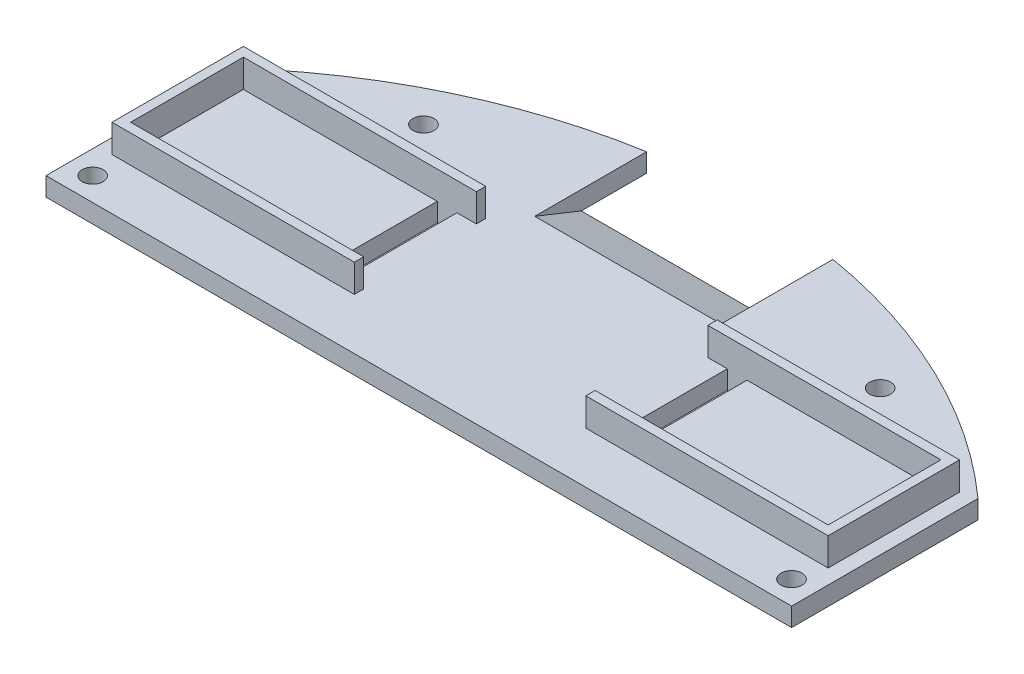
ISO-10303-21;
HEADER;
FILE_DESCRIPTION(('STEP AP214'),'2;1');
FILE_NAME('part.step','',(''),(''),'','','');
FILE_SCHEMA(('AUTOMOTIVE_DESIGN { 1 0 10303 214 1 1 1 1 }'));
ENDSEC;
DATA;
#1=APPLICATION_CONTEXT('core data for automotive mechanical design processes');
#2=APPLICATION_PROTOCOL_DEFINITION('international standard','automotive_design',2000,#1);
#3=PRODUCT_CONTEXT('',#1,'mechanical');
#4=PRODUCT('Part','Part','',(#3));
#5=PRODUCT_RELATED_PRODUCT_CATEGORY('part','',(#4));
#6=PRODUCT_DEFINITION_FORMATION('','',#4);
#7=PRODUCT_DEFINITION_CONTEXT('part definition',#1,'design');
#8=PRODUCT_DEFINITION('design','',#6,#7);
#9=PRODUCT_DEFINITION_SHAPE('','',#8);
#10=(LENGTH_UNIT() NAMED_UNIT(*) SI_UNIT(.MILLI.,.METRE.));
#11=(NAMED_UNIT(*) PLANE_ANGLE_UNIT() SI_UNIT($,.RADIAN.));
#12=(NAMED_UNIT(*) SI_UNIT($,.STERADIAN.) SOLID_ANGLE_UNIT());
#13=UNCERTAINTY_MEASURE_WITH_UNIT(LENGTH_MEASURE(1.E-05),#10,'distance_accuracy_value','');
#14=(GEOMETRIC_REPRESENTATION_CONTEXT(3) GLOBAL_UNCERTAINTY_ASSIGNED_CONTEXT((#13)) GLOBAL_UNIT_ASSIGNED_CONTEXT((#10,
#11,#12)) REPRESENTATION_CONTEXT('',''));
#15=CARTESIAN_POINT('',(0.,0.,0.));
#16=DIRECTION('',(0.,0.,1.));
#17=DIRECTION('',(1.,0.,0.));
#18=AXIS2_PLACEMENT_3D('',#15,#16,#17);
#19=CARTESIAN_POINT('',(0.,2.,34.7213595499958));
#20=DIRECTION('',(0.,-1.,0.));
#21=DIRECTION('',(0.,0.,-1.));
#22=AXIS2_PLACEMENT_3D('',#19,#20,#21);
#23=PLANE('',#22);
#24=DIRECTION('',(-1.,0.,0.));
#25=VECTOR('',#24,1.);
#26=CARTESIAN_POINT('',(-12.4199999977621,2.,3.5));
#27=LINE('',#26,#25);
#28=CARTESIAN_POINT('',(-16.62,2.,3.5));
#29=VERTEX_POINT('',#28);
#30=CARTESIAN_POINT('',(-37.42,2.,3.5));
#31=VERTEX_POINT('',#30);
#32=EDGE_CURVE('E283',#29,#31,#27,.T.);
#33=ORIENTED_EDGE('',*,*,#32,.F.);
#34=DIRECTION('',(0.,0.,1.));
#35=VECTOR('',#34,1.);
#36=CARTESIAN_POINT('',(-16.62,2.,-8.59999999999999));
#37=LINE('',#36,#35);
#38=CARTESIAN_POINT('',(-16.62,2.,-8.6));
#39=VERTEX_POINT('',#38);
#40=EDGE_CURVE('E371',#39,#29,#37,.T.);
#41=ORIENTED_EDGE('',*,*,#40,.F.);
#42=DIRECTION('',(1.,0.,0.));
#43=VECTOR('',#42,1.);
#44=CARTESIAN_POINT('',(-37.42,2.,-8.6));
#45=LINE('',#44,#43);
#46=CARTESIAN_POINT('',(-37.42,2.,-8.6));
#47=VERTEX_POINT('',#46);
#48=EDGE_CURVE('E927',#47,#39,#45,.T.);
#49=ORIENTED_EDGE('',*,*,#48,.F.);
#50=DIRECTION('',(0.,0.,-1.));
#51=VECTOR('',#50,1.);
#52=CARTESIAN_POINT('',(-37.42,2.,3.5));
#53=LINE('',#52,#51);
#54=EDGE_CURVE('E288',#31,#47,#53,.T.);
#55=ORIENTED_EDGE('',*,*,#54,.F.);
#56=EDGE_LOOP('',(#33,#41,#49,#55));
#57=FACE_BOUND('',#56,.T.);
#58=ADVANCED_FACE('F43',(#57),#23,.F.);
#59=DIRECTION('',(-1.,0.,0.));
#60=VECTOR('',#59,1.);
#61=CARTESIAN_POINT('',(12.4199999977621,2.,3.5));
#62=LINE('',#61,#60);
#63=CARTESIAN_POINT('',(14.5,2.,3.5));
#64=VERTEX_POINT('',#63);
#65=CARTESIAN_POINT('',(12.4199999977621,2.,3.5));
#66=VERTEX_POINT('',#65);
#67=EDGE_CURVE('E345',#64,#66,#62,.T.);
#68=ORIENTED_EDGE('',*,*,#67,.F.);
#69=DIRECTION('',(0.,0.,1.));
#70=VECTOR('',#69,1.);
#71=CARTESIAN_POINT('',(14.5,2.,-8.6));
#72=LINE('',#71,#70);
#73=CARTESIAN_POINT('',(14.5,2.,-8.6));
#74=VERTEX_POINT('',#73);
#75=EDGE_CURVE('E419',#74,#64,#72,.T.);
#76=ORIENTED_EDGE('',*,*,#75,.F.);
#77=DIRECTION('',(1.,0.,0.));
#78=VECTOR('',#77,1.);
#79=CARTESIAN_POINT('',(37.42,2.,-8.6));
#80=LINE('',#79,#78);
#81=CARTESIAN_POINT('',(12.4199999977621,2.,-8.6));
#82=VERTEX_POINT('',#81);
#83=EDGE_CURVE('E336',#82,#74,#80,.T.);
#84=ORIENTED_EDGE('',*,*,#83,.F.);
#85=DIRECTION('',(0.,0.,1.));
#86=VECTOR('',#85,1.);
#87=CARTESIAN_POINT('',(12.4199999977621,2.,-8.6));
#88=LINE('',#87,#86);
#89=CARTESIAN_POINT('',(12.4199999977621,2.,-9.5999999955243));
#90=VERTEX_POINT('',#89);
#91=EDGE_CURVE('E333',#90,#82,#88,.T.);
#92=ORIENTED_EDGE('',*,*,#91,.F.);
#93=DIRECTION('',(-1.,0.,0.));
#94=VECTOR('',#93,1.);
#95=CARTESIAN_POINT('',(38.4199999977621,2.,-9.5999999955243));
#96=LINE('',#95,#94);
#97=CARTESIAN_POINT('',(38.4199999977621,2.,-9.5999999955243));
#98=VERTEX_POINT('',#97);
#99=EDGE_CURVE('E330',#98,#90,#96,.T.);
#100=ORIENTED_EDGE('',*,*,#99,.F.);
#101=DIRECTION('',(0.,0.,-1.));
#102=VECTOR('',#101,1.);
#103=CARTESIAN_POINT('',(38.4199999977621,2.,4.4999999955243));
#104=LINE('',#103,#102);
#105=CARTESIAN_POINT('',(38.4199999977621,2.,4.4999999955243));
#106=VERTEX_POINT('',#105);
#107=EDGE_CURVE('E327',#106,#98,#104,.T.);
#108=ORIENTED_EDGE('',*,*,#107,.F.);
#109=DIRECTION('',(1.,0.,0.));
#110=VECTOR('',#109,1.);
#111=CARTESIAN_POINT('',(12.4199999977621,2.,4.4999999955243));
#112=LINE('',#111,#110);
#113=CARTESIAN_POINT('',(12.4199999977621,2.,4.4999999955243));
#114=VERTEX_POINT('',#113);
#115=EDGE_CURVE('E286',#114,#106,#112,.T.);
#116=ORIENTED_EDGE('',*,*,#115,.F.);
#117=DIRECTION('',(0.,0.,1.));
#118=VECTOR('',#117,1.);
#119=CARTESIAN_POINT('',(12.4199999977621,2.,3.5));
#120=LINE('',#119,#118);
#121=EDGE_CURVE('E282',#66,#114,#120,.T.);
#122=ORIENTED_EDGE('',*,*,#121,.F.);
#123=EDGE_LOOP('',(#68,#76,#84,#92,#100,#108,#116,#122));
#124=FACE_BOUND('',#123,.T.);
#125=CARTESIAN_POINT('',(24.5,2.,-15.));
#126=DIRECTION('',(0.,1.,0.));
#127=DIRECTION('',(0.,0.,-1.));
#128=AXIS2_PLACEMENT_3D('',#125,#126,#127);
#129=CIRCLE('',#128,1.125);
#130=CARTESIAN_POINT('',(24.5,2.,-16.125));
#131=VERTEX_POINT('',#130);
#132=EDGE_CURVE('E395',#131,#131,#129,.T.);
#133=ORIENTED_EDGE('',*,*,#132,.F.);
#134=EDGE_LOOP('',(#133));
#135=FACE_BOUND('',#134,.T.);
#136=CARTESIAN_POINT('',(37.4903810567666,2.,7.5));
#137=DIRECTION('',(0.,1.,0.));
#138=DIRECTION('',(0.,0.,-1.));
#139=AXIS2_PLACEMENT_3D('',#136,#137,#138);
#140=CIRCLE('',#139,1.125);
#141=CARTESIAN_POINT('',(37.4903810567666,2.,6.375));
#142=VERTEX_POINT('',#141);
#143=EDGE_CURVE('E401',#142,#142,#140,.T.);
#144=ORIENTED_EDGE('',*,*,#143,.F.);
#145=EDGE_LOOP('',(#144));
#146=FACE_BOUND('',#145,.T.);
#147=CARTESIAN_POINT('',(-24.5,2.,-15.));
#148=DIRECTION('',(0.,1.,0.));
#149=DIRECTION('',(0.,0.,1.));
#150=AXIS2_PLACEMENT_3D('',#147,#148,#149);
#151=CIRCLE('',#150,1.125);
#152=CARTESIAN_POINT('',(-24.5,2.,-13.875));
#153=VERTEX_POINT('',#152);
#154=EDGE_CURVE('E407',#153,#153,#151,.T.);
#155=ORIENTED_EDGE('',*,*,#154,.F.);
#156=EDGE_LOOP('',(#155));
#157=FACE_BOUND('',#156,.T.);
#158=CARTESIAN_POINT('',(-37.4903810567666,2.,7.5));
#159=DIRECTION('',(0.,1.,0.));
#160=DIRECTION('',(0.,0.,1.));
#161=AXIS2_PLACEMENT_3D('',#158,#159,#160);
#162=CIRCLE('',#161,1.125);
#163=CARTESIAN_POINT('',(-37.4903810567666,2.,8.625));
#164=VERTEX_POINT('',#163);
#165=EDGE_CURVE('E413',#164,#164,#162,.T.);
#166=ORIENTED_EDGE('',*,*,#165,.F.);
#167=EDGE_LOOP('',(#166));
#168=FACE_BOUND('',#167,.T.);
#169=DIRECTION('',(-1.,0.,0.));
#170=VECTOR('',#169,1.);
#171=CARTESIAN_POINT('',(0.,2.,-12.4394382810003));
#172=LINE('',#171,#170);
#173=CARTESIAN_POINT('',(10.,2.,-12.4394382810003));
#174=VERTEX_POINT('',#173);
#175=CARTESIAN_POINT('',(-10.,2.,-12.4394382810003));
#176=VERTEX_POINT('',#175);
#177=EDGE_CURVE('E494',#174,#176,#172,.T.);
#178=ORIENTED_EDGE('',*,*,#177,.T.);
#179=DIRECTION('',(0.,0.,-1.));
#180=VECTOR('',#179,1.);
#181=CARTESIAN_POINT('',(-10.,2.,-24.4394382810004));
#182=LINE('',#181,#180);
#183=CARTESIAN_POINT('',(-10.,2.,-24.4394382810004));
#184=VERTEX_POINT('',#183);
#185=EDGE_CURVE('E59',#176,#184,#182,.T.);
#186=ORIENTED_EDGE('',*,*,#185,.T.);
#187=CARTESIAN_POINT('',(0.,2.,34.7213595499958));
#188=DIRECTION('',(0.,1.,0.));
#189=DIRECTION('',(0.,0.,-1.));
#190=AXIS2_PLACEMENT_3D('',#187,#188,#189);
#191=CIRCLE('',#190,60.);
#192=CARTESIAN_POINT('',(-40.,2.,-10.));
#193=VERTEX_POINT('',#192);
#194=EDGE_CURVE('E452',#184,#193,#191,.T.);
#195=ORIENTED_EDGE('',*,*,#194,.T.);
#196=DIRECTION('',(0.,0.,1.));
#197=VECTOR('',#196,1.);
#198=CARTESIAN_POINT('',(-40.,2.,10.));
#199=LINE('',#198,#197);
#200=CARTESIAN_POINT('',(-40.,2.,10.));
#201=VERTEX_POINT('',#200);
#202=EDGE_CURVE('E454',#193,#201,#199,.T.);
#203=ORIENTED_EDGE('',*,*,#202,.T.);
#204=DIRECTION('',(1.,0.,0.));
#205=VECTOR('',#204,1.);
#206=CARTESIAN_POINT('',(-40.,2.,10.));
#207=LINE('',#206,#205);
#208=CARTESIAN_POINT('',(40.,2.,10.));
#209=VERTEX_POINT('',#208);
#210=EDGE_CURVE('E456',#201,#209,#207,.T.);
#211=ORIENTED_EDGE('',*,*,#210,.T.);
#212=DIRECTION('',(0.,0.,-1.));
#213=VECTOR('',#212,1.);
#214=CARTESIAN_POINT('',(40.,2.,10.));
#215=LINE('',#214,#213);
#216=CARTESIAN_POINT('',(40.,2.,-10.));
#217=VERTEX_POINT('',#216);
#218=EDGE_CURVE('E458',#209,#217,#215,.T.);
#219=ORIENTED_EDGE('',*,*,#218,.T.);
#220=CARTESIAN_POINT('',(0.,2.,34.7213595499958));
#221=DIRECTION('',(0.,1.,0.));
#222=DIRECTION('',(0.,0.,-1.));
#223=AXIS2_PLACEMENT_3D('',#220,#221,#222);
#224=CIRCLE('',#223,60.);
#225=CARTESIAN_POINT('',(10.,2.,-24.4394382810004));
#226=VERTEX_POINT('',#225);
#227=EDGE_CURVE('E447',#217,#226,#224,.T.);
#228=ORIENTED_EDGE('',*,*,#227,.T.);
#229=DIRECTION('',(0.,0.,1.));
#230=VECTOR('',#229,1.);
#231=CARTESIAN_POINT('',(10.,2.,-17.4394382810004));
#232=LINE('',#231,#230);
#233=EDGE_CURVE('E67',#226,#174,#232,.T.);
#234=ORIENTED_EDGE('',*,*,#233,.T.);
#235=EDGE_LOOP('',(#178,#186,#195,#203,#211,#219,#228,#234));
#236=FACE_BOUND('',#235,.T.);
#237=CARTESIAN_POINT('',(-12.4199999977621,2.,3.5));
#238=VERTEX_POINT('',#237);
#239=CARTESIAN_POINT('',(-14.5,2.,3.5));
#240=VERTEX_POINT('',#239);
#241=EDGE_CURVE('E272',#238,#240,#27,.T.);
#242=ORIENTED_EDGE('',*,*,#241,.F.);
#243=DIRECTION('',(0.,0.,-1.));
#244=VECTOR('',#243,1.);
#245=CARTESIAN_POINT('',(-12.4199999977621,2.,3.5));
#246=LINE('',#245,#244);
#247=CARTESIAN_POINT('',(-12.4199999977621,2.,4.4999999955243));
#248=VERTEX_POINT('',#247);
#249=EDGE_CURVE('E254',#248,#238,#246,.T.);
#250=ORIENTED_EDGE('',*,*,#249,.F.);
#251=DIRECTION('',(1.,0.,0.));
#252=VECTOR('',#251,1.);
#253=CARTESIAN_POINT('',(-12.4199999977621,2.,4.4999999955243));
#254=LINE('',#253,#252);
#255=CARTESIAN_POINT('',(-38.4199999977621,2.,4.4999999955243));
#256=VERTEX_POINT('',#255);
#257=EDGE_CURVE('E265',#256,#248,#254,.T.);
#258=ORIENTED_EDGE('',*,*,#257,.F.);
#259=DIRECTION('',(0.,0.,1.));
#260=VECTOR('',#259,1.);
#261=CARTESIAN_POINT('',(-38.4199999977621,2.,4.4999999955243));
#262=LINE('',#261,#260);
#263=CARTESIAN_POINT('',(-38.4199999977621,2.,-9.5999999955243));
#264=VERTEX_POINT('',#263);
#265=EDGE_CURVE('E921',#264,#256,#262,.T.);
#266=ORIENTED_EDGE('',*,*,#265,.F.);
#267=DIRECTION('',(-1.,0.,0.));
#268=VECTOR('',#267,1.);
#269=CARTESIAN_POINT('',(-38.4199999977621,2.,-9.5999999955243));
#270=LINE('',#269,#268);
#271=CARTESIAN_POINT('',(-12.4199999977621,2.,-9.5999999955243));
#272=VERTEX_POINT('',#271);
#273=EDGE_CURVE('E923',#272,#264,#270,.T.);
#274=ORIENTED_EDGE('',*,*,#273,.F.);
#275=DIRECTION('',(0.,0.,-1.));
#276=VECTOR('',#275,1.);
#277=CARTESIAN_POINT('',(-12.4199999977621,2.,-8.6));
#278=LINE('',#277,#276);
#279=CARTESIAN_POINT('',(-12.4199999977621,2.,-8.6));
#280=VERTEX_POINT('',#279);
#281=EDGE_CURVE('E925',#280,#272,#278,.T.);
#282=ORIENTED_EDGE('',*,*,#281,.F.);
#283=CARTESIAN_POINT('',(-14.5,2.,-8.6));
#284=VERTEX_POINT('',#283);
#285=EDGE_CURVE('E926',#284,#280,#45,.T.);
#286=ORIENTED_EDGE('',*,*,#285,.F.);
#287=DIRECTION('',(0.,0.,-1.));
#288=VECTOR('',#287,1.);
#289=CARTESIAN_POINT('',(-14.5,2.,-8.6));
#290=LINE('',#289,#288);
#291=EDGE_CURVE('E281',#240,#284,#290,.T.);
#292=ORIENTED_EDGE('',*,*,#291,.F.);
#293=EDGE_LOOP('',(#242,#250,#258,#266,#274,#282,#286,#292));
#294=FACE_BOUND('',#293,.T.);
#295=ADVANCED_FACE('F279',(#124,#135,#146,#157,#168,#236,#294),#23,.F.);
#296=CARTESIAN_POINT('',(37.42,2.,3.5));
#297=VERTEX_POINT('',#296);
#298=CARTESIAN_POINT('',(16.62,2.,3.5));
#299=VERTEX_POINT('',#298);
#300=EDGE_CURVE('E310',#297,#299,#62,.T.);
#301=ORIENTED_EDGE('',*,*,#300,.F.);
#302=DIRECTION('',(0.,0.,1.));
#303=VECTOR('',#302,1.);
#304=CARTESIAN_POINT('',(37.42,2.,3.5));
#305=LINE('',#304,#303);
#306=CARTESIAN_POINT('',(37.42,2.,-8.6));
#307=VERTEX_POINT('',#306);
#308=EDGE_CURVE('E339',#307,#297,#305,.T.);
#309=ORIENTED_EDGE('',*,*,#308,.F.);
#310=CARTESIAN_POINT('',(16.62,2.,-8.6));
#311=VERTEX_POINT('',#310);
#312=EDGE_CURVE('E340',#311,#307,#80,.T.);
#313=ORIENTED_EDGE('',*,*,#312,.F.);
#314=DIRECTION('',(0.,0.,-1.));
#315=VECTOR('',#314,1.);
#316=CARTESIAN_POINT('',(16.62,2.,-8.6));
#317=LINE('',#316,#315);
#318=EDGE_CURVE('E422',#299,#311,#317,.T.);
#319=ORIENTED_EDGE('',*,*,#318,.F.);
#320=EDGE_LOOP('',(#301,#309,#313,#319));
#321=FACE_BOUND('',#320,.T.);
#322=ADVANCED_FACE('F532',(#321),#23,.F.);
#323=CARTESIAN_POINT('',(0.,0.,34.7213595499958));
#324=DIRECTION('',(0.,-1.,0.));
#325=DIRECTION('',(0.,0.,-1.));
#326=AXIS2_PLACEMENT_3D('',#323,#324,#325);
#327=PLANE('',#326);
#328=CARTESIAN_POINT('',(37.4903810567666,0.,7.5));
#329=DIRECTION('',(0.,1.,0.));
#330=DIRECTION('',(0.,0.,-1.));
#331=AXIS2_PLACEMENT_3D('',#328,#329,#330);
#332=CIRCLE('',#331,1.125);
#333=CARTESIAN_POINT('',(37.4903810567666,0.,6.375));
#334=VERTEX_POINT('',#333);
#335=EDGE_CURVE('E398',#334,#334,#332,.T.);
#336=ORIENTED_EDGE('',*,*,#335,.T.);
#337=EDGE_LOOP('',(#336));
#338=FACE_BOUND('',#337,.T.);
#339=CARTESIAN_POINT('',(-37.4903810567666,0.,7.5));
#340=DIRECTION('',(0.,1.,0.));
#341=DIRECTION('',(0.,0.,1.));
#342=AXIS2_PLACEMENT_3D('',#339,#340,#341);
#343=CIRCLE('',#342,1.125);
#344=CARTESIAN_POINT('',(-37.4903810567666,0.,8.625));
#345=VERTEX_POINT('',#344);
#346=EDGE_CURVE('E410',#345,#345,#343,.T.);
#347=ORIENTED_EDGE('',*,*,#346,.T.);
#348=EDGE_LOOP('',(#347));
#349=FACE_BOUND('',#348,.T.);
#350=CARTESIAN_POINT('',(0.,0.,34.7213595499958));
#351=DIRECTION('',(0.,1.,0.));
#352=DIRECTION('',(0.,0.,-1.));
#353=AXIS2_PLACEMENT_3D('',#350,#351,#352);
#354=CIRCLE('',#353,60.);
#355=CARTESIAN_POINT('',(40.,0.,-10.));
#356=VERTEX_POINT('',#355);
#357=CARTESIAN_POINT('',(10.,0.,-24.4394382810004));
#358=VERTEX_POINT('',#357);
#359=EDGE_CURVE('E446',#356,#358,#354,.T.);
#360=ORIENTED_EDGE('',*,*,#359,.F.);
#361=DIRECTION('',(0.,0.,-1.));
#362=VECTOR('',#361,1.);
#363=CARTESIAN_POINT('',(40.,0.,10.));
#364=LINE('',#363,#362);
#365=CARTESIAN_POINT('',(40.,0.,10.));
#366=VERTEX_POINT('',#365);
#367=EDGE_CURVE('E449',#366,#356,#364,.T.);
#368=ORIENTED_EDGE('',*,*,#367,.F.);
#369=DIRECTION('',(1.,0.,0.));
#370=VECTOR('',#369,1.);
#371=CARTESIAN_POINT('',(-40.,0.,10.));
#372=LINE('',#371,#370);
#373=CARTESIAN_POINT('',(-40.,0.,10.));
#374=VERTEX_POINT('',#373);
#375=EDGE_CURVE('E474',#374,#366,#372,.T.);
#376=ORIENTED_EDGE('',*,*,#375,.F.);
#377=DIRECTION('',(0.,0.,1.));
#378=VECTOR('',#377,1.);
#379=CARTESIAN_POINT('',(-40.,0.,10.));
#380=LINE('',#379,#378);
#381=CARTESIAN_POINT('',(-40.,0.,-10.));
#382=VERTEX_POINT('',#381);
#383=EDGE_CURVE('E472',#382,#374,#380,.T.);
#384=ORIENTED_EDGE('',*,*,#383,.F.);
#385=CARTESIAN_POINT('',(0.,0.,34.7213595499958));
#386=DIRECTION('',(0.,1.,0.));
#387=DIRECTION('',(0.,0.,-1.));
#388=AXIS2_PLACEMENT_3D('',#385,#386,#387);
#389=CIRCLE('',#388,60.);
#390=CARTESIAN_POINT('',(-10.,0.,-24.4394382810004));
#391=VERTEX_POINT('',#390);
#392=EDGE_CURVE('E470',#391,#382,#389,.T.);
#393=ORIENTED_EDGE('',*,*,#392,.F.);
#394=DIRECTION('',(0.,0.,-1.));
#395=VECTOR('',#394,1.);
#396=CARTESIAN_POINT('',(-10.,0.,-24.4394382810004));
#397=LINE('',#396,#395);
#398=CARTESIAN_POINT('',(-10.,0.,-17.4394382810004));
#399=VERTEX_POINT('',#398);
#400=EDGE_CURVE('E468',#399,#391,#397,.T.);
#401=ORIENTED_EDGE('',*,*,#400,.F.);
#402=DIRECTION('',(-1.,0.,0.));
#403=VECTOR('',#402,1.);
#404=CARTESIAN_POINT('',(-10.,0.,-17.4394382810004));
#405=LINE('',#404,#403);
#406=CARTESIAN_POINT('',(10.,0.,-17.4394382810004));
#407=VERTEX_POINT('',#406);
#408=EDGE_CURVE('E465',#407,#399,#405,.T.);
#409=ORIENTED_EDGE('',*,*,#408,.F.);
#410=DIRECTION('',(0.,0.,1.));
#411=VECTOR('',#410,1.);
#412=CARTESIAN_POINT('',(10.,0.,-17.4394382810004));
#413=LINE('',#412,#411);
#414=EDGE_CURVE('E463',#358,#407,#413,.T.);
#415=ORIENTED_EDGE('',*,*,#414,.F.);
#416=EDGE_LOOP('',(#360,#368,#376,#384,#393,#401,#409,#415));
#417=FACE_BOUND('',#416,.T.);
#418=DIRECTION('',(-1.,0.,0.));
#419=VECTOR('',#418,1.);
#420=CARTESIAN_POINT('',(14.5,0.,-8.6));
#421=LINE('',#420,#419);
#422=CARTESIAN_POINT('',(16.62,0.,-8.6));
#423=VERTEX_POINT('',#422);
#424=CARTESIAN_POINT('',(14.5,0.,-8.6));
#425=VERTEX_POINT('',#424);
#426=EDGE_CURVE('E423',#423,#425,#421,.T.);
#427=ORIENTED_EDGE('',*,*,#426,.T.);
#428=DIRECTION('',(0.,0.,1.));
#429=VECTOR('',#428,1.);
#430=CARTESIAN_POINT('',(14.5,0.,-8.6));
#431=LINE('',#430,#429);
#432=CARTESIAN_POINT('',(14.5,0.,3.5));
#433=VERTEX_POINT('',#432);
#434=EDGE_CURVE('E416',#425,#433,#431,.T.);
#435=ORIENTED_EDGE('',*,*,#434,.T.);
#436=DIRECTION('',(1.,0.,0.));
#437=VECTOR('',#436,1.);
#438=CARTESIAN_POINT('',(14.5,0.,3.5));
#439=LINE('',#438,#437);
#440=CARTESIAN_POINT('',(16.62,0.,3.5));
#441=VERTEX_POINT('',#440);
#442=EDGE_CURVE('E429',#433,#441,#439,.T.);
#443=ORIENTED_EDGE('',*,*,#442,.T.);
#444=DIRECTION('',(0.,0.,-1.));
#445=VECTOR('',#444,1.);
#446=CARTESIAN_POINT('',(16.62,0.,-8.6));
#447=LINE('',#446,#445);
#448=EDGE_CURVE('E432',#441,#423,#447,.T.);
#449=ORIENTED_EDGE('',*,*,#448,.T.);
#450=EDGE_LOOP('',(#427,#435,#443,#449));
#451=FACE_BOUND('',#450,.T.);
#452=CARTESIAN_POINT('',(-24.5,0.,-15.));
#453=DIRECTION('',(0.,1.,0.));
#454=DIRECTION('',(0.,0.,1.));
#455=AXIS2_PLACEMENT_3D('',#452,#453,#454);
#456=CIRCLE('',#455,1.125);
#457=CARTESIAN_POINT('',(-24.5,0.,-13.875));
#458=VERTEX_POINT('',#457);
#459=EDGE_CURVE('E404',#458,#458,#456,.T.);
#460=ORIENTED_EDGE('',*,*,#459,.T.);
#461=EDGE_LOOP('',(#460));
#462=FACE_BOUND('',#461,.T.);
#463=CARTESIAN_POINT('',(24.5,0.,-15.));
#464=DIRECTION('',(0.,1.,0.));
#465=DIRECTION('',(0.,0.,-1.));
#466=AXIS2_PLACEMENT_3D('',#463,#464,#465);
#467=CIRCLE('',#466,1.125);
#468=CARTESIAN_POINT('',(24.5,0.,-16.125));
#469=VERTEX_POINT('',#468);
#470=EDGE_CURVE('E394',#469,#469,#467,.T.);
#471=ORIENTED_EDGE('',*,*,#470,.T.);
#472=EDGE_LOOP('',(#471));
#473=FACE_BOUND('',#472,.T.);
#474=DIRECTION('',(1.,0.,0.));
#475=VECTOR('',#474,1.);
#476=CARTESIAN_POINT('',(-14.5,0.,3.5));
#477=LINE('',#476,#475);
#478=CARTESIAN_POINT('',(-16.62,0.,3.50000000000001));
#479=VERTEX_POINT('',#478);
#480=CARTESIAN_POINT('',(-14.5,0.,3.5));
#481=VERTEX_POINT('',#480);
#482=EDGE_CURVE('E372',#479,#481,#477,.T.);
#483=ORIENTED_EDGE('',*,*,#482,.T.);
#484=DIRECTION('',(0.,0.,-1.));
#485=VECTOR('',#484,1.);
#486=CARTESIAN_POINT('',(-14.5,0.,-8.6));
#487=LINE('',#486,#485);
#488=CARTESIAN_POINT('',(-14.5,0.,-8.6));
#489=VERTEX_POINT('',#488);
#490=EDGE_CURVE('E369',#481,#489,#487,.T.);
#491=ORIENTED_EDGE('',*,*,#490,.T.);
#492=DIRECTION('',(-1.,0.,0.));
#493=VECTOR('',#492,1.);
#494=CARTESIAN_POINT('',(-14.5,0.,-8.6));
#495=LINE('',#494,#493);
#496=CARTESIAN_POINT('',(-16.62,0.,-8.59999999999999));
#497=VERTEX_POINT('',#496);
#498=EDGE_CURVE('E378',#489,#497,#495,.T.);
#499=ORIENTED_EDGE('',*,*,#498,.T.);
#500=DIRECTION('',(0.,0.,1.));
#501=VECTOR('',#500,1.);
#502=CARTESIAN_POINT('',(-16.62,0.,-8.59999999999999));
#503=LINE('',#502,#501);
#504=EDGE_CURVE('E381',#497,#479,#503,.T.);
#505=ORIENTED_EDGE('',*,*,#504,.T.);
#506=EDGE_LOOP('',(#483,#491,#499,#505));
#507=FACE_BOUND('',#506,.T.);
#508=ADVANCED_FACE('F503',(#338,#349,#417,#451,#462,#473,#507),#327,.T.);
#509=CARTESIAN_POINT('',(0.,2.,34.7213595499958));
#510=DIRECTION('',(0.,-1.,0.));
#511=DIRECTION('',(0.,0.,-1.));
#512=AXIS2_PLACEMENT_3D('',#509,#510,#511);
#513=CYLINDRICAL_SURFACE('',#512,60.);
#514=ORIENTED_EDGE('',*,*,#359,.T.);
#515=DIRECTION('',(0.,-1.,0.));
#516=VECTOR('',#515,1.);
#517=CARTESIAN_POINT('',(10.,2.,-24.4394382810004));
#518=LINE('',#517,#516);
#519=EDGE_CURVE('E491',#226,#358,#518,.T.);
#520=ORIENTED_EDGE('',*,*,#519,.F.);
#521=ORIENTED_EDGE('',*,*,#227,.F.);
#522=DIRECTION('',(0.,-1.,0.));
#523=VECTOR('',#522,1.);
#524=CARTESIAN_POINT('',(40.,2.,-10.));
#525=LINE('',#524,#523);
#526=EDGE_CURVE('E460',#217,#356,#525,.T.);
#527=ORIENTED_EDGE('',*,*,#526,.T.);
#528=EDGE_LOOP('',(#514,#520,#521,#527));
#529=FACE_BOUND('',#528,.T.);
#530=ADVANCED_FACE('F513',(#529),#513,.T.);
#531=CARTESIAN_POINT('',(10.,2.,-17.4394382810004));
#532=DIRECTION('',(1.,0.,0.));
#533=DIRECTION('',(0.,0.,-1.));
#534=AXIS2_PLACEMENT_3D('',#531,#532,#533);
#535=PLANE('',#534);
#536=ORIENTED_EDGE('',*,*,#414,.T.);
#537=DIRECTION('',(0.,-0.371390676354101,-0.92847669088526));
#538=VECTOR('',#537,1.);
#539=CARTESIAN_POINT('',(10.,0.275862068965512,-16.7497831085866));
#540=LINE('',#539,#538);
#541=EDGE_CURVE('E11',#407,#174,#540,.F.);
#542=ORIENTED_EDGE('',*,*,#541,.T.);
#543=ORIENTED_EDGE('',*,*,#233,.F.);
#544=ORIENTED_EDGE('',*,*,#519,.T.);
#545=EDGE_LOOP('',(#536,#542,#543,#544));
#546=FACE_BOUND('',#545,.T.);
#547=ADVANCED_FACE('F508',(#546),#535,.F.);
#548=CARTESIAN_POINT('',(-10.,2.,-24.4394382810004));
#549=DIRECTION('',(-1.,0.,0.));
#550=DIRECTION('',(0.,0.,1.));
#551=AXIS2_PLACEMENT_3D('',#548,#549,#550);
#552=PLANE('',#551);
#553=ORIENTED_EDGE('',*,*,#400,.T.);
#554=DIRECTION('',(0.,-1.,0.));
#555=VECTOR('',#554,1.);
#556=CARTESIAN_POINT('',(-10.,2.,-24.4394382810004));
#557=LINE('',#556,#555);
#558=EDGE_CURVE('E488',#184,#391,#557,.T.);
#559=ORIENTED_EDGE('',*,*,#558,.F.);
#560=ORIENTED_EDGE('',*,*,#185,.F.);
#561=DIRECTION('',(0.,0.371390676354101,0.92847669088526));
#562=VECTOR('',#561,1.);
#563=CARTESIAN_POINT('',(-10.,-2.13793103448275,-22.7842658672073));
#564=LINE('',#563,#562);
#565=EDGE_CURVE('E52',#176,#399,#564,.F.);
#566=ORIENTED_EDGE('',*,*,#565,.T.);
#567=EDGE_LOOP('',(#553,#559,#560,#566));
#568=FACE_BOUND('',#567,.T.);
#569=ADVANCED_FACE('F496',(#568),#552,.F.);
#570=CARTESIAN_POINT('',(0.,2.,34.7213595499958));
#571=DIRECTION('',(0.,-1.,0.));
#572=DIRECTION('',(0.,0.,-1.));
#573=AXIS2_PLACEMENT_3D('',#570,#571,#572);
#574=CYLINDRICAL_SURFACE('',#573,60.);
#575=ORIENTED_EDGE('',*,*,#392,.T.);
#576=DIRECTION('',(0.,-1.,0.));
#577=VECTOR('',#576,1.);
#578=CARTESIAN_POINT('',(-40.,2.,-10.));
#579=LINE('',#578,#577);
#580=EDGE_CURVE('E485',#193,#382,#579,.T.);
#581=ORIENTED_EDGE('',*,*,#580,.F.);
#582=ORIENTED_EDGE('',*,*,#194,.F.);
#583=ORIENTED_EDGE('',*,*,#558,.T.);
#584=EDGE_LOOP('',(#575,#581,#582,#583));
#585=FACE_BOUND('',#584,.T.);
#586=ADVANCED_FACE('F530',(#585),#574,.T.);
#587=CARTESIAN_POINT('',(-40.,2.,10.));
#588=DIRECTION('',(1.,0.,0.));
#589=DIRECTION('',(0.,0.,-1.));
#590=AXIS2_PLACEMENT_3D('',#587,#588,#589);
#591=PLANE('',#590);
#592=ORIENTED_EDGE('',*,*,#383,.T.);
#593=DIRECTION('',(0.,-1.,0.));
#594=VECTOR('',#593,1.);
#595=CARTESIAN_POINT('',(-40.,2.,10.));
#596=LINE('',#595,#594);
#597=EDGE_CURVE('E482',#201,#374,#596,.T.);
#598=ORIENTED_EDGE('',*,*,#597,.F.);
#599=ORIENTED_EDGE('',*,*,#202,.F.);
#600=ORIENTED_EDGE('',*,*,#580,.T.);
#601=EDGE_LOOP('',(#592,#598,#599,#600));
#602=FACE_BOUND('',#601,.T.);
#603=ADVANCED_FACE('F525',(#602),#591,.F.);
#604=CARTESIAN_POINT('',(-40.,2.,10.));
#605=DIRECTION('',(0.,0.,-1.));
#606=DIRECTION('',(-1.,0.,0.));
#607=AXIS2_PLACEMENT_3D('',#604,#605,#606);
#608=PLANE('',#607);
#609=ORIENTED_EDGE('',*,*,#375,.T.);
#610=DIRECTION('',(0.,-1.,0.));
#611=VECTOR('',#610,1.);
#612=CARTESIAN_POINT('',(40.,2.,10.));
#613=LINE('',#612,#611);
#614=EDGE_CURVE('E479',#209,#366,#613,.T.);
#615=ORIENTED_EDGE('',*,*,#614,.F.);
#616=ORIENTED_EDGE('',*,*,#210,.F.);
#617=ORIENTED_EDGE('',*,*,#597,.T.);
#618=EDGE_LOOP('',(#609,#615,#616,#617));
#619=FACE_BOUND('',#618,.T.);
#620=ADVANCED_FACE('F522',(#619),#608,.F.);
#621=CARTESIAN_POINT('',(40.,2.,10.));
#622=DIRECTION('',(-1.,0.,0.));
#623=DIRECTION('',(0.,0.,1.));
#624=AXIS2_PLACEMENT_3D('',#621,#622,#623);
#625=PLANE('',#624);
#626=ORIENTED_EDGE('',*,*,#367,.T.);
#627=ORIENTED_EDGE('',*,*,#526,.F.);
#628=ORIENTED_EDGE('',*,*,#218,.F.);
#629=ORIENTED_EDGE('',*,*,#614,.T.);
#630=EDGE_LOOP('',(#626,#627,#628,#629));
#631=FACE_BOUND('',#630,.T.);
#632=ADVANCED_FACE('F518',(#631),#625,.F.);
#633=CARTESIAN_POINT('',(14.5,2.,-8.6));
#634=DIRECTION('',(1.,0.,0.));
#635=DIRECTION('',(0.,0.,-1.));
#636=AXIS2_PLACEMENT_3D('',#633,#634,#635);
#637=PLANE('',#636);
#638=ORIENTED_EDGE('',*,*,#434,.F.);
#639=DIRECTION('',(0.,-1.,0.));
#640=VECTOR('',#639,1.);
#641=CARTESIAN_POINT('',(14.5,2.,-8.6));
#642=LINE('',#641,#640);
#643=EDGE_CURVE('E426',#74,#425,#642,.T.);
#644=ORIENTED_EDGE('',*,*,#643,.F.);
#645=ORIENTED_EDGE('',*,*,#75,.T.);
#646=DIRECTION('',(0.,-1.,0.));
#647=VECTOR('',#646,1.);
#648=CARTESIAN_POINT('',(14.5,2.,3.5));
#649=LINE('',#648,#647);
#650=EDGE_CURVE('E443',#64,#433,#649,.T.);
#651=ORIENTED_EDGE('',*,*,#650,.T.);
#652=EDGE_LOOP('',(#638,#644,#645,#651));
#653=FACE_BOUND('',#652,.T.);
#654=ADVANCED_FACE('F546',(#653),#637,.T.);
#655=CARTESIAN_POINT('',(14.5,2.,3.5));
#656=DIRECTION('',(0.,0.,-1.));
#657=DIRECTION('',(-1.,0.,0.));
#658=AXIS2_PLACEMENT_3D('',#655,#656,#657);
#659=PLANE('',#658);
#660=ORIENTED_EDGE('',*,*,#442,.F.);
#661=ORIENTED_EDGE('',*,*,#650,.F.);
#662=ORIENTED_EDGE('',*,*,#67,.T.);
#663=DIRECTION('',(0.,-1.,0.));
#664=VECTOR('',#663,1.);
#665=CARTESIAN_POINT('',(12.4199999977621,5.,3.5));
#666=LINE('',#665,#664);
#667=CARTESIAN_POINT('',(12.4199999977621,5.,3.5));
#668=VERTEX_POINT('',#667);
#669=EDGE_CURVE('E323',#668,#66,#666,.T.);
#670=ORIENTED_EDGE('',*,*,#669,.F.);
#671=DIRECTION('',(-1.,0.,0.));
#672=VECTOR('',#671,1.);
#673=CARTESIAN_POINT('',(12.4199999977621,5.,3.5));
#674=LINE('',#673,#672);
#675=CARTESIAN_POINT('',(37.42,5.,3.5));
#676=VERTEX_POINT('',#675);
#677=EDGE_CURVE('E322',#676,#668,#674,.T.);
#678=ORIENTED_EDGE('',*,*,#677,.F.);
#679=DIRECTION('',(0.,-1.,0.));
#680=VECTOR('',#679,1.);
#681=CARTESIAN_POINT('',(37.42,5.,3.5));
#682=LINE('',#681,#680);
#683=EDGE_CURVE('E348',#676,#297,#682,.T.);
#684=ORIENTED_EDGE('',*,*,#683,.T.);
#685=ORIENTED_EDGE('',*,*,#300,.T.);
#686=DIRECTION('',(0.,-1.,0.));
#687=VECTOR('',#686,1.);
#688=CARTESIAN_POINT('',(16.62,2.,3.5));
#689=LINE('',#688,#687);
#690=EDGE_CURVE('E441',#299,#441,#689,.T.);
#691=ORIENTED_EDGE('',*,*,#690,.T.);
#692=EDGE_LOOP('',(#660,#661,#662,#670,#678,#684,#685,#691));
#693=FACE_BOUND('',#692,.T.);
#694=ADVANCED_FACE('F646',(#693),#659,.T.);
#695=CARTESIAN_POINT('',(16.62,2.,-8.6));
#696=DIRECTION('',(-1.,0.,0.));
#697=DIRECTION('',(0.,0.,1.));
#698=AXIS2_PLACEMENT_3D('',#695,#696,#697);
#699=PLANE('',#698);
#700=ORIENTED_EDGE('',*,*,#448,.F.);
#701=ORIENTED_EDGE('',*,*,#690,.F.);
#702=ORIENTED_EDGE('',*,*,#318,.T.);
#703=DIRECTION('',(0.,-1.,0.));
#704=VECTOR('',#703,1.);
#705=CARTESIAN_POINT('',(16.62,2.,-8.6));
#706=LINE('',#705,#704);
#707=EDGE_CURVE('E439',#311,#423,#706,.T.);
#708=ORIENTED_EDGE('',*,*,#707,.T.);
#709=EDGE_LOOP('',(#700,#701,#702,#708));
#710=FACE_BOUND('',#709,.T.);
#711=ADVANCED_FACE('F654',(#710),#699,.T.);
#712=CARTESIAN_POINT('',(14.5,2.,-8.6));
#713=DIRECTION('',(0.,0.,1.));
#714=DIRECTION('',(1.,0.,0.));
#715=AXIS2_PLACEMENT_3D('',#712,#713,#714);
#716=PLANE('',#715);
#717=ORIENTED_EDGE('',*,*,#426,.F.);
#718=ORIENTED_EDGE('',*,*,#707,.F.);
#719=ORIENTED_EDGE('',*,*,#312,.T.);
#720=DIRECTION('',(0.,-1.,0.));
#721=VECTOR('',#720,1.);
#722=CARTESIAN_POINT('',(37.42,5.,-8.6));
#723=LINE('',#722,#721);
#724=CARTESIAN_POINT('',(37.42,5.,-8.6));
#725=VERTEX_POINT('',#724);
#726=EDGE_CURVE('E351',#725,#307,#723,.T.);
#727=ORIENTED_EDGE('',*,*,#726,.F.);
#728=DIRECTION('',(1.,0.,0.));
#729=VECTOR('',#728,1.);
#730=CARTESIAN_POINT('',(37.42,5.,-8.6));
#731=LINE('',#730,#729);
#732=CARTESIAN_POINT('',(12.4199999977621,5.,-8.6));
#733=VERTEX_POINT('',#732);
#734=EDGE_CURVE('E318',#733,#725,#731,.T.);
#735=ORIENTED_EDGE('',*,*,#734,.F.);
#736=DIRECTION('',(0.,-1.,0.));
#737=VECTOR('',#736,1.);
#738=CARTESIAN_POINT('',(12.4199999977621,5.,-8.6));
#739=LINE('',#738,#737);
#740=EDGE_CURVE('E354',#733,#82,#739,.T.);
#741=ORIENTED_EDGE('',*,*,#740,.T.);
#742=ORIENTED_EDGE('',*,*,#83,.T.);
#743=ORIENTED_EDGE('',*,*,#643,.T.);
#744=EDGE_LOOP('',(#717,#718,#719,#727,#735,#741,#742,#743));
#745=FACE_BOUND('',#744,.T.);
#746=ADVANCED_FACE('F597',(#745),#716,.T.);
#747=CARTESIAN_POINT('',(-37.4903810567666,2.,7.5));
#748=DIRECTION('',(0.,-1.,0.));
#749=DIRECTION('',(0.,0.,-1.));
#750=AXIS2_PLACEMENT_3D('',#747,#748,#749);
#751=CYLINDRICAL_SURFACE('',#750,1.125);
#752=ORIENTED_EDGE('',*,*,#165,.T.);
#753=EDGE_LOOP('',(#752));
#754=FACE_BOUND('',#753,.T.);
#755=ORIENTED_EDGE('',*,*,#346,.F.);
#756=EDGE_LOOP('',(#755));
#757=FACE_BOUND('',#756,.T.);
#758=ADVANCED_FACE('F592',(#754,#757),#751,.F.);
#759=CARTESIAN_POINT('',(-24.5,2.,-15.));
#760=DIRECTION('',(0.,-1.,0.));
#761=DIRECTION('',(0.,0.,-1.));
#762=AXIS2_PLACEMENT_3D('',#759,#760,#761);
#763=CYLINDRICAL_SURFACE('',#762,1.125);
#764=ORIENTED_EDGE('',*,*,#154,.T.);
#765=EDGE_LOOP('',(#764));
#766=FACE_BOUND('',#765,.T.);
#767=ORIENTED_EDGE('',*,*,#459,.F.);
#768=EDGE_LOOP('',(#767));
#769=FACE_BOUND('',#768,.T.);
#770=ADVANCED_FACE('F596',(#766,#769),#763,.F.);
#771=CARTESIAN_POINT('',(37.4903810567666,2.,7.5));
#772=DIRECTION('',(0.,-1.,0.));
#773=DIRECTION('',(0.,0.,-1.));
#774=AXIS2_PLACEMENT_3D('',#771,#772,#773);
#775=CYLINDRICAL_SURFACE('',#774,1.125);
#776=ORIENTED_EDGE('',*,*,#143,.T.);
#777=EDGE_LOOP('',(#776));
#778=FACE_BOUND('',#777,.T.);
#779=ORIENTED_EDGE('',*,*,#335,.F.);
#780=EDGE_LOOP('',(#779));
#781=FACE_BOUND('',#780,.T.);
#782=ADVANCED_FACE('F607',(#778,#781),#775,.F.);
#783=CARTESIAN_POINT('',(24.5,2.,-15.));
#784=DIRECTION('',(0.,-1.,0.));
#785=DIRECTION('',(0.,0.,-1.));
#786=AXIS2_PLACEMENT_3D('',#783,#784,#785);
#787=CYLINDRICAL_SURFACE('',#786,1.125);
#788=ORIENTED_EDGE('',*,*,#132,.T.);
#789=EDGE_LOOP('',(#788));
#790=FACE_BOUND('',#789,.T.);
#791=ORIENTED_EDGE('',*,*,#470,.F.);
#792=EDGE_LOOP('',(#791));
#793=FACE_BOUND('',#792,.T.);
#794=ADVANCED_FACE('F616',(#790,#793),#787,.F.);
#795=CARTESIAN_POINT('',(-14.5,2.,-8.6));
#796=DIRECTION('',(-1.,0.,0.));
#797=DIRECTION('',(0.,0.,1.));
#798=AXIS2_PLACEMENT_3D('',#795,#796,#797);
#799=PLANE('',#798);
#800=ORIENTED_EDGE('',*,*,#490,.F.);
#801=DIRECTION('',(0.,-1.,0.));
#802=VECTOR('',#801,1.);
#803=CARTESIAN_POINT('',(-14.5,2.,3.5));
#804=LINE('',#803,#802);
#805=EDGE_CURVE('E375',#240,#481,#804,.T.);
#806=ORIENTED_EDGE('',*,*,#805,.F.);
#807=ORIENTED_EDGE('',*,*,#291,.T.);
#808=DIRECTION('',(0.,-1.,0.));
#809=VECTOR('',#808,1.);
#810=CARTESIAN_POINT('',(-14.5,2.,-8.6));
#811=LINE('',#810,#809);
#812=EDGE_CURVE('E391',#284,#489,#811,.T.);
#813=ORIENTED_EDGE('',*,*,#812,.T.);
#814=EDGE_LOOP('',(#800,#806,#807,#813));
#815=FACE_BOUND('',#814,.T.);
#816=ADVANCED_FACE('F624',(#815),#799,.T.);
#817=CARTESIAN_POINT('',(-14.5,2.,-8.6));
#818=DIRECTION('',(0.,0.,1.));
#819=DIRECTION('',(1.,0.,0.));
#820=AXIS2_PLACEMENT_3D('',#817,#818,#819);
#821=PLANE('',#820);
#822=ORIENTED_EDGE('',*,*,#498,.F.);
#823=ORIENTED_EDGE('',*,*,#812,.F.);
#824=ORIENTED_EDGE('',*,*,#285,.T.);
#825=DIRECTION('',(0.,-1.,0.));
#826=VECTOR('',#825,1.);
#827=CARTESIAN_POINT('',(-12.4199999977621,5.,-8.6));
#828=LINE('',#827,#826);
#829=CARTESIAN_POINT('',(-12.4199999977621,5.,-8.6));
#830=VERTEX_POINT('',#829);
#831=EDGE_CURVE('E905',#830,#280,#828,.T.);
#832=ORIENTED_EDGE('',*,*,#831,.F.);
#833=DIRECTION('',(1.,0.,0.));
#834=VECTOR('',#833,1.);
#835=CARTESIAN_POINT('',(-37.42,5.,-8.6));
#836=LINE('',#835,#834);
#837=CARTESIAN_POINT('',(-37.42,5.,-8.6));
#838=VERTEX_POINT('',#837);
#839=EDGE_CURVE('E301',#838,#830,#836,.T.);
#840=ORIENTED_EDGE('',*,*,#839,.F.);
#841=DIRECTION('',(0.,-1.,0.));
#842=VECTOR('',#841,1.);
#843=CARTESIAN_POINT('',(-37.42,5.,-8.6));
#844=LINE('',#843,#842);
#845=EDGE_CURVE('E902',#838,#47,#844,.T.);
#846=ORIENTED_EDGE('',*,*,#845,.T.);
#847=ORIENTED_EDGE('',*,*,#48,.T.);
#848=DIRECTION('',(0.,-1.,0.));
#849=VECTOR('',#848,1.);
#850=CARTESIAN_POINT('',(-16.62,2.,-8.59999999999999));
#851=LINE('',#850,#849);
#852=EDGE_CURVE('E389',#39,#497,#851,.T.);
#853=ORIENTED_EDGE('',*,*,#852,.T.);
#854=EDGE_LOOP('',(#822,#823,#824,#832,#840,#846,#847,#853));
#855=FACE_BOUND('',#854,.T.);
#856=ADVANCED_FACE('F676',(#855),#821,.T.);
#857=CARTESIAN_POINT('',(-16.62,2.,-8.59999999999999));
#858=DIRECTION('',(1.,0.,0.));
#859=DIRECTION('',(0.,0.,-1.));
#860=AXIS2_PLACEMENT_3D('',#857,#858,#859);
#861=PLANE('',#860);
#862=ORIENTED_EDGE('',*,*,#504,.F.);
#863=ORIENTED_EDGE('',*,*,#852,.F.);
#864=ORIENTED_EDGE('',*,*,#40,.T.);
#865=DIRECTION('',(0.,-1.,0.));
#866=VECTOR('',#865,1.);
#867=CARTESIAN_POINT('',(-16.62,2.,3.50000000000001));
#868=LINE('',#867,#866);
#869=EDGE_CURVE('E387',#29,#479,#868,.T.);
#870=ORIENTED_EDGE('',*,*,#869,.T.);
#871=EDGE_LOOP('',(#862,#863,#864,#870));
#872=FACE_BOUND('',#871,.T.);
#873=ADVANCED_FACE('F685',(#872),#861,.T.);
#874=CARTESIAN_POINT('',(-14.5,2.,3.5));
#875=DIRECTION('',(0.,0.,-1.));
#876=DIRECTION('',(-1.,0.,0.));
#877=AXIS2_PLACEMENT_3D('',#874,#875,#876);
#878=PLANE('',#877);
#879=ORIENTED_EDGE('',*,*,#482,.F.);
#880=ORIENTED_EDGE('',*,*,#869,.F.);
#881=ORIENTED_EDGE('',*,*,#32,.T.);
#882=DIRECTION('',(0.,-1.,0.));
#883=VECTOR('',#882,1.);
#884=CARTESIAN_POINT('',(-37.42,5.,3.5));
#885=LINE('',#884,#883);
#886=CARTESIAN_POINT('',(-37.42,5.,3.5));
#887=VERTEX_POINT('',#886);
#888=EDGE_CURVE('E899',#887,#31,#885,.T.);
#889=ORIENTED_EDGE('',*,*,#888,.F.);
#890=DIRECTION('',(-1.,0.,0.));
#891=VECTOR('',#890,1.);
#892=CARTESIAN_POINT('',(-12.4199999977621,5.,3.5));
#893=LINE('',#892,#891);
#894=CARTESIAN_POINT('',(-12.4199999977621,5.,3.5));
#895=VERTEX_POINT('',#894);
#896=EDGE_CURVE('E266',#895,#887,#893,.T.);
#897=ORIENTED_EDGE('',*,*,#896,.F.);
#898=DIRECTION('',(0.,-1.,0.));
#899=VECTOR('',#898,1.);
#900=CARTESIAN_POINT('',(-12.4199999977621,5.,3.5));
#901=LINE('',#900,#899);
#902=EDGE_CURVE('E258',#895,#238,#901,.T.);
#903=ORIENTED_EDGE('',*,*,#902,.T.);
#904=ORIENTED_EDGE('',*,*,#241,.T.);
#905=ORIENTED_EDGE('',*,*,#805,.T.);
#906=EDGE_LOOP('',(#879,#880,#881,#889,#897,#903,#904,#905));
#907=FACE_BOUND('',#906,.T.);
#908=ADVANCED_FACE('F270',(#907),#878,.T.);
#909=CARTESIAN_POINT('',(12.4199999977621,5.,3.5));
#910=DIRECTION('',(1.,0.,0.));
#911=DIRECTION('',(0.,0.,-1.));
#912=AXIS2_PLACEMENT_3D('',#909,#910,#911);
#913=PLANE('',#912);
#914=ORIENTED_EDGE('',*,*,#121,.T.);
#915=DIRECTION('',(0.,-1.,0.));
#916=VECTOR('',#915,1.);
#917=CARTESIAN_POINT('',(12.4199999977621,5.,4.4999999955243));
#918=LINE('',#917,#916);
#919=CARTESIAN_POINT('',(12.4199999977621,5.,4.4999999955243));
#920=VERTEX_POINT('',#919);
#921=EDGE_CURVE('E366',#920,#114,#918,.T.);
#922=ORIENTED_EDGE('',*,*,#921,.F.);
#923=DIRECTION('',(0.,0.,1.));
#924=VECTOR('',#923,1.);
#925=CARTESIAN_POINT('',(12.4199999977621,5.,3.5));
#926=LINE('',#925,#924);
#927=EDGE_CURVE('E306',#668,#920,#926,.T.);
#928=ORIENTED_EDGE('',*,*,#927,.F.);
#929=ORIENTED_EDGE('',*,*,#669,.T.);
#930=EDGE_LOOP('',(#914,#922,#928,#929));
#931=FACE_BOUND('',#930,.T.);
#932=ADVANCED_FACE('F702',(#931),#913,.F.);
#933=CARTESIAN_POINT('',(12.4199999977621,5.,4.4999999955243));
#934=DIRECTION('',(0.,0.,-1.));
#935=DIRECTION('',(-1.,0.,0.));
#936=AXIS2_PLACEMENT_3D('',#933,#934,#935);
#937=PLANE('',#936);
#938=ORIENTED_EDGE('',*,*,#115,.T.);
#939=DIRECTION('',(0.,-1.,0.));
#940=VECTOR('',#939,1.);
#941=CARTESIAN_POINT('',(38.4199999977621,5.,4.4999999955243));
#942=LINE('',#941,#940);
#943=CARTESIAN_POINT('',(38.4199999977621,5.,4.4999999955243));
#944=VERTEX_POINT('',#943);
#945=EDGE_CURVE('E363',#944,#106,#942,.T.);
#946=ORIENTED_EDGE('',*,*,#945,.F.);
#947=DIRECTION('',(1.,0.,0.));
#948=VECTOR('',#947,1.);
#949=CARTESIAN_POINT('',(12.4199999977621,5.,4.4999999955243));
#950=LINE('',#949,#948);
#951=EDGE_CURVE('E309',#920,#944,#950,.T.);
#952=ORIENTED_EDGE('',*,*,#951,.F.);
#953=ORIENTED_EDGE('',*,*,#921,.T.);
#954=EDGE_LOOP('',(#938,#946,#952,#953));
#955=FACE_BOUND('',#954,.T.);
#956=ADVANCED_FACE('F709',(#955),#937,.F.);
#957=CARTESIAN_POINT('',(38.4199999977621,5.,4.4999999955243));
#958=DIRECTION('',(-1.,0.,0.));
#959=DIRECTION('',(0.,0.,1.));
#960=AXIS2_PLACEMENT_3D('',#957,#958,#959);
#961=PLANE('',#960);
#962=ORIENTED_EDGE('',*,*,#107,.T.);
#963=DIRECTION('',(0.,-1.,0.));
#964=VECTOR('',#963,1.);
#965=CARTESIAN_POINT('',(38.4199999977621,5.,-9.5999999955243));
#966=LINE('',#965,#964);
#967=CARTESIAN_POINT('',(38.4199999977621,5.,-9.5999999955243));
#968=VERTEX_POINT('',#967);
#969=EDGE_CURVE('E360',#968,#98,#966,.T.);
#970=ORIENTED_EDGE('',*,*,#969,.F.);
#971=DIRECTION('',(0.,0.,-1.));
#972=VECTOR('',#971,1.);
#973=CARTESIAN_POINT('',(38.4199999977621,5.,4.4999999955243));
#974=LINE('',#973,#972);
#975=EDGE_CURVE('E312',#944,#968,#974,.T.);
#976=ORIENTED_EDGE('',*,*,#975,.F.);
#977=ORIENTED_EDGE('',*,*,#945,.T.);
#978=EDGE_LOOP('',(#962,#970,#976,#977));
#979=FACE_BOUND('',#978,.T.);
#980=ADVANCED_FACE('F718',(#979),#961,.F.);
#981=CARTESIAN_POINT('',(38.4199999977621,5.,-9.5999999955243));
#982=DIRECTION('',(0.,0.,1.));
#983=DIRECTION('',(1.,0.,0.));
#984=AXIS2_PLACEMENT_3D('',#981,#982,#983);
#985=PLANE('',#984);
#986=ORIENTED_EDGE('',*,*,#99,.T.);
#987=DIRECTION('',(0.,-1.,0.));
#988=VECTOR('',#987,1.);
#989=CARTESIAN_POINT('',(12.4199999977621,5.,-9.5999999955243));
#990=LINE('',#989,#988);
#991=CARTESIAN_POINT('',(12.4199999977621,5.,-9.5999999955243));
#992=VERTEX_POINT('',#991);
#993=EDGE_CURVE('E357',#992,#90,#990,.T.);
#994=ORIENTED_EDGE('',*,*,#993,.F.);
#995=DIRECTION('',(-1.,0.,0.));
#996=VECTOR('',#995,1.);
#997=CARTESIAN_POINT('',(38.4199999977621,5.,-9.5999999955243));
#998=LINE('',#997,#996);
#999=EDGE_CURVE('E314',#968,#992,#998,.T.);
#1000=ORIENTED_EDGE('',*,*,#999,.F.);
#1001=ORIENTED_EDGE('',*,*,#969,.T.);
#1002=EDGE_LOOP('',(#986,#994,#1000,#1001));
#1003=FACE_BOUND('',#1002,.T.);
#1004=ADVANCED_FACE('F727',(#1003),#985,.F.);
#1005=CARTESIAN_POINT('',(12.4199999977621,5.,-8.6));
#1006=DIRECTION('',(1.,0.,0.));
#1007=DIRECTION('',(0.,0.,-1.));
#1008=AXIS2_PLACEMENT_3D('',#1005,#1006,#1007);
#1009=PLANE('',#1008);
#1010=ORIENTED_EDGE('',*,*,#91,.T.);
#1011=ORIENTED_EDGE('',*,*,#740,.F.);
#1012=DIRECTION('',(0.,0.,1.));
#1013=VECTOR('',#1012,1.);
#1014=CARTESIAN_POINT('',(12.4199999977621,5.,-8.6));
#1015=LINE('',#1014,#1013);
#1016=EDGE_CURVE('E316',#992,#733,#1015,.T.);
#1017=ORIENTED_EDGE('',*,*,#1016,.F.);
#1018=ORIENTED_EDGE('',*,*,#993,.T.);
#1019=EDGE_LOOP('',(#1010,#1011,#1017,#1018));
#1020=FACE_BOUND('',#1019,.T.);
#1021=ADVANCED_FACE('F736',(#1020),#1009,.F.);
#1022=CARTESIAN_POINT('',(37.42,5.,3.5));
#1023=DIRECTION('',(1.,0.,0.));
#1024=DIRECTION('',(0.,0.,-1.));
#1025=AXIS2_PLACEMENT_3D('',#1022,#1023,#1024);
#1026=PLANE('',#1025);
#1027=ORIENTED_EDGE('',*,*,#308,.T.);
#1028=ORIENTED_EDGE('',*,*,#683,.F.);
#1029=DIRECTION('',(0.,0.,1.));
#1030=VECTOR('',#1029,1.);
#1031=CARTESIAN_POINT('',(37.42,5.,3.5));
#1032=LINE('',#1031,#1030);
#1033=EDGE_CURVE('E320',#725,#676,#1032,.T.);
#1034=ORIENTED_EDGE('',*,*,#1033,.F.);
#1035=ORIENTED_EDGE('',*,*,#726,.T.);
#1036=EDGE_LOOP('',(#1027,#1028,#1034,#1035));
#1037=FACE_BOUND('',#1036,.T.);
#1038=ADVANCED_FACE('F745',(#1037),#1026,.F.);
#1039=CARTESIAN_POINT('',(0.,5.,0.));
#1040=DIRECTION('',(0.,1.,0.));
#1041=DIRECTION('',(0.,0.,1.));
#1042=AXIS2_PLACEMENT_3D('',#1039,#1040,#1041);
#1043=PLANE('',#1042);
#1044=ORIENTED_EDGE('',*,*,#927,.T.);
#1045=ORIENTED_EDGE('',*,*,#951,.T.);
#1046=ORIENTED_EDGE('',*,*,#975,.T.);
#1047=ORIENTED_EDGE('',*,*,#999,.T.);
#1048=ORIENTED_EDGE('',*,*,#1016,.T.);
#1049=ORIENTED_EDGE('',*,*,#734,.T.);
#1050=ORIENTED_EDGE('',*,*,#1033,.T.);
#1051=ORIENTED_EDGE('',*,*,#677,.T.);
#1052=EDGE_LOOP('',(#1044,#1045,#1046,#1047,#1048,#1049,#1050,#1051));
#1053=FACE_BOUND('',#1052,.T.);
#1054=ADVANCED_FACE('F754',(#1053),#1043,.T.);
#1055=CARTESIAN_POINT('',(-37.42,5.,3.5));
#1056=DIRECTION('',(-1.,0.,0.));
#1057=DIRECTION('',(0.,0.,1.));
#1058=AXIS2_PLACEMENT_3D('',#1055,#1056,#1057);
#1059=PLANE('',#1058);
#1060=ORIENTED_EDGE('',*,*,#54,.T.);
#1061=ORIENTED_EDGE('',*,*,#845,.F.);
#1062=DIRECTION('',(0.,0.,-1.));
#1063=VECTOR('',#1062,1.);
#1064=CARTESIAN_POINT('',(-37.42,5.,3.5));
#1065=LINE('',#1064,#1063);
#1066=EDGE_CURVE('E303',#887,#838,#1065,.T.);
#1067=ORIENTED_EDGE('',*,*,#1066,.F.);
#1068=ORIENTED_EDGE('',*,*,#888,.T.);
#1069=EDGE_LOOP('',(#1060,#1061,#1067,#1068));
#1070=FACE_BOUND('',#1069,.T.);
#1071=ADVANCED_FACE('F763',(#1070),#1059,.F.);
#1072=CARTESIAN_POINT('',(-12.4199999977621,5.,-8.6));
#1073=DIRECTION('',(-1.,0.,0.));
#1074=DIRECTION('',(0.,0.,1.));
#1075=AXIS2_PLACEMENT_3D('',#1072,#1073,#1074);
#1076=PLANE('',#1075);
#1077=ORIENTED_EDGE('',*,*,#281,.T.);
#1078=DIRECTION('',(0.,-1.,0.));
#1079=VECTOR('',#1078,1.);
#1080=CARTESIAN_POINT('',(-12.4199999977621,5.,-9.5999999955243));
#1081=LINE('',#1080,#1079);
#1082=CARTESIAN_POINT('',(-12.4199999977621,5.,-9.5999999955243));
#1083=VERTEX_POINT('',#1082);
#1084=EDGE_CURVE('E910',#1083,#272,#1081,.T.);
#1085=ORIENTED_EDGE('',*,*,#1084,.F.);
#1086=DIRECTION('',(0.,0.,-1.));
#1087=VECTOR('',#1086,1.);
#1088=CARTESIAN_POINT('',(-12.4199999977621,5.,-8.6));
#1089=LINE('',#1088,#1087);
#1090=EDGE_CURVE('E299',#830,#1083,#1089,.T.);
#1091=ORIENTED_EDGE('',*,*,#1090,.F.);
#1092=ORIENTED_EDGE('',*,*,#831,.T.);
#1093=EDGE_LOOP('',(#1077,#1085,#1091,#1092));
#1094=FACE_BOUND('',#1093,.T.);
#1095=ADVANCED_FACE('F772',(#1094),#1076,.F.);
#1096=CARTESIAN_POINT('',(-38.4199999977621,5.,-9.5999999955243));
#1097=DIRECTION('',(0.,0.,1.));
#1098=DIRECTION('',(1.,0.,0.));
#1099=AXIS2_PLACEMENT_3D('',#1096,#1097,#1098);
#1100=PLANE('',#1099);
#1101=ORIENTED_EDGE('',*,*,#273,.T.);
#1102=DIRECTION('',(0.,-1.,0.));
#1103=VECTOR('',#1102,1.);
#1104=CARTESIAN_POINT('',(-38.4199999977621,5.,-9.5999999955243));
#1105=LINE('',#1104,#1103);
#1106=CARTESIAN_POINT('',(-38.4199999977621,5.,-9.5999999955243));
#1107=VERTEX_POINT('',#1106);
#1108=EDGE_CURVE('E913',#1107,#264,#1105,.T.);
#1109=ORIENTED_EDGE('',*,*,#1108,.F.);
#1110=DIRECTION('',(-1.,0.,0.));
#1111=VECTOR('',#1110,1.);
#1112=CARTESIAN_POINT('',(-38.4199999977621,5.,-9.5999999955243));
#1113=LINE('',#1112,#1111);
#1114=EDGE_CURVE('E297',#1083,#1107,#1113,.T.);
#1115=ORIENTED_EDGE('',*,*,#1114,.F.);
#1116=ORIENTED_EDGE('',*,*,#1084,.T.);
#1117=EDGE_LOOP('',(#1101,#1109,#1115,#1116));
#1118=FACE_BOUND('',#1117,.T.);
#1119=ADVANCED_FACE('F781',(#1118),#1100,.F.);
#1120=CARTESIAN_POINT('',(-38.4199999977621,5.,4.4999999955243));
#1121=DIRECTION('',(1.,0.,0.));
#1122=DIRECTION('',(0.,0.,-1.));
#1123=AXIS2_PLACEMENT_3D('',#1120,#1121,#1122);
#1124=PLANE('',#1123);
#1125=ORIENTED_EDGE('',*,*,#265,.T.);
#1126=DIRECTION('',(0.,-1.,0.));
#1127=VECTOR('',#1126,1.);
#1128=CARTESIAN_POINT('',(-38.4199999977621,5.,4.4999999955243));
#1129=LINE('',#1128,#1127);
#1130=CARTESIAN_POINT('',(-38.4199999977621,5.,4.4999999955243));
#1131=VERTEX_POINT('',#1130);
#1132=EDGE_CURVE('E916',#1131,#256,#1129,.T.);
#1133=ORIENTED_EDGE('',*,*,#1132,.F.);
#1134=DIRECTION('',(0.,0.,1.));
#1135=VECTOR('',#1134,1.);
#1136=CARTESIAN_POINT('',(-38.4199999977621,5.,4.4999999955243));
#1137=LINE('',#1136,#1135);
#1138=EDGE_CURVE('E295',#1107,#1131,#1137,.T.);
#1139=ORIENTED_EDGE('',*,*,#1138,.F.);
#1140=ORIENTED_EDGE('',*,*,#1108,.T.);
#1141=EDGE_LOOP('',(#1125,#1133,#1139,#1140));
#1142=FACE_BOUND('',#1141,.T.);
#1143=ADVANCED_FACE('F790',(#1142),#1124,.F.);
#1144=CARTESIAN_POINT('',(-12.4199999977621,5.,4.4999999955243));
#1145=DIRECTION('',(0.,0.,-1.));
#1146=DIRECTION('',(-1.,0.,0.));
#1147=AXIS2_PLACEMENT_3D('',#1144,#1145,#1146);
#1148=PLANE('',#1147);
#1149=ORIENTED_EDGE('',*,*,#257,.T.);
#1150=DIRECTION('',(0.,-1.,0.));
#1151=VECTOR('',#1150,1.);
#1152=CARTESIAN_POINT('',(-12.4199999977621,5.,4.4999999955243));
#1153=LINE('',#1152,#1151);
#1154=CARTESIAN_POINT('',(-12.4199999977621,5.,4.4999999955243));
#1155=VERTEX_POINT('',#1154);
#1156=EDGE_CURVE('E261',#1155,#248,#1153,.T.);
#1157=ORIENTED_EDGE('',*,*,#1156,.F.);
#1158=DIRECTION('',(1.,0.,0.));
#1159=VECTOR('',#1158,1.);
#1160=CARTESIAN_POINT('',(-12.4199999977621,5.,4.4999999955243));
#1161=LINE('',#1160,#1159);
#1162=EDGE_CURVE('E293',#1131,#1155,#1161,.T.);
#1163=ORIENTED_EDGE('',*,*,#1162,.F.);
#1164=ORIENTED_EDGE('',*,*,#1132,.T.);
#1165=EDGE_LOOP('',(#1149,#1157,#1163,#1164));
#1166=FACE_BOUND('',#1165,.T.);
#1167=ADVANCED_FACE('F799',(#1166),#1148,.F.);
#1168=CARTESIAN_POINT('',(-12.4199999977621,5.,3.5));
#1169=DIRECTION('',(-1.,0.,0.));
#1170=DIRECTION('',(0.,0.,1.));
#1171=AXIS2_PLACEMENT_3D('',#1168,#1169,#1170);
#1172=PLANE('',#1171);
#1173=ORIENTED_EDGE('',*,*,#249,.T.);
#1174=ORIENTED_EDGE('',*,*,#902,.F.);
#1175=DIRECTION('',(0.,0.,-1.));
#1176=VECTOR('',#1175,1.);
#1177=CARTESIAN_POINT('',(-12.4199999977621,5.,3.5));
#1178=LINE('',#1177,#1176);
#1179=EDGE_CURVE('E276',#1155,#895,#1178,.T.);
#1180=ORIENTED_EDGE('',*,*,#1179,.F.);
#1181=ORIENTED_EDGE('',*,*,#1156,.T.);
#1182=EDGE_LOOP('',(#1173,#1174,#1180,#1181));
#1183=FACE_BOUND('',#1182,.T.);
#1184=ADVANCED_FACE('F256',(#1183),#1172,.F.);
#1185=CARTESIAN_POINT('',(0.,5.,0.));
#1186=DIRECTION('',(0.,-1.,0.));
#1187=DIRECTION('',(0.,0.,-1.));
#1188=AXIS2_PLACEMENT_3D('',#1185,#1186,#1187);
#1189=PLANE('',#1188);
#1190=ORIENTED_EDGE('',*,*,#896,.T.);
#1191=ORIENTED_EDGE('',*,*,#1066,.T.);
#1192=ORIENTED_EDGE('',*,*,#839,.T.);
#1193=ORIENTED_EDGE('',*,*,#1090,.T.);
#1194=ORIENTED_EDGE('',*,*,#1114,.T.);
#1195=ORIENTED_EDGE('',*,*,#1138,.T.);
#1196=ORIENTED_EDGE('',*,*,#1162,.T.);
#1197=ORIENTED_EDGE('',*,*,#1179,.T.);
#1198=EDGE_LOOP('',(#1190,#1191,#1192,#1193,#1194,#1195,#1196,#1197));
#1199=FACE_BOUND('',#1198,.T.);
#1200=ADVANCED_FACE('F815',(#1199),#1189,.F.);
#1201=CARTESIAN_POINT('',(0.,2.,-12.4394382810003));
#1202=DIRECTION('',(0.,-0.928476690885261,0.371390676354101));
#1203=DIRECTION('',(-1.,0.,0.));
#1204=AXIS2_PLACEMENT_3D('',#1201,#1202,#1203);
#1205=PLANE('',#1204);
#1206=ORIENTED_EDGE('',*,*,#541,.F.);
#1207=ORIENTED_EDGE('',*,*,#408,.T.);
#1208=ORIENTED_EDGE('',*,*,#565,.F.);
#1209=ORIENTED_EDGE('',*,*,#177,.F.);
#1210=EDGE_LOOP('',(#1206,#1207,#1208,#1209));
#1211=FACE_BOUND('',#1210,.T.);
#1212=ADVANCED_FACE('F46',(#1211),#1205,.F.);
#1213=CLOSED_SHELL('',(#58,#295,#322,#508,#530,#547,#569,#586,#603,#620,#632,#654,#694,#711,
#746,#758,#770,#782,#794,#816,#856,#873,#908,#932,#956,#980,#1004,#1021,#1038,#1054,#1071,#1095,
#1119,#1143,#1167,#1184,#1200,#1212));
#1214=MANIFOLD_SOLID_BREP('B2',#1213);
#1215=ADVANCED_BREP_SHAPE_REPRESENTATION('',(#18,#1214),#14);
#1216=SHAPE_DEFINITION_REPRESENTATION(#9,#1215);
ENDSEC;
END-ISO-10303-21;
